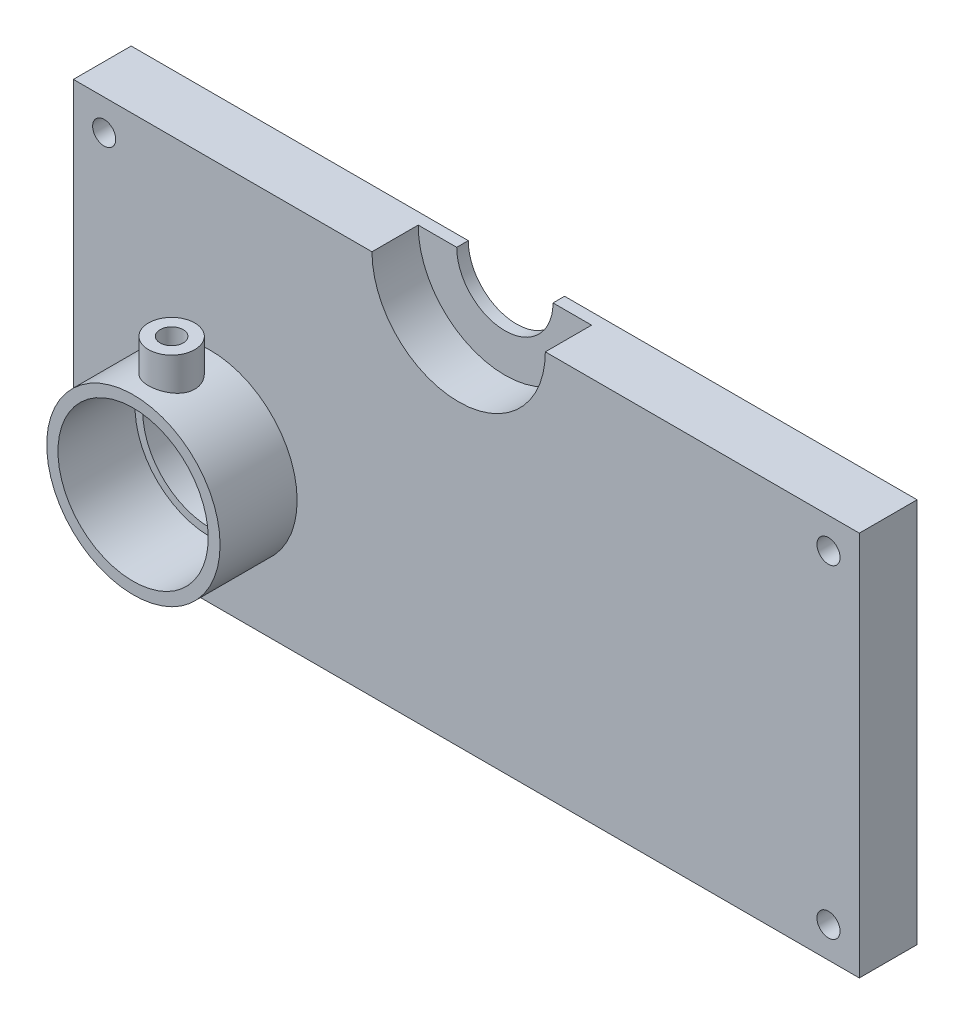
ISO-10303-21;
HEADER;
FILE_DESCRIPTION(('STEP AP214'),'2;1');
FILE_NAME('part.step','',(''),(''),'','','');
FILE_SCHEMA(('AUTOMOTIVE_DESIGN { 1 0 10303 214 1 1 1 1 }'));
ENDSEC;
DATA;
#1=APPLICATION_CONTEXT('core data for automotive mechanical design processes');
#2=APPLICATION_PROTOCOL_DEFINITION('international standard','automotive_design',2000,#1);
#3=PRODUCT_CONTEXT('',#1,'mechanical');
#4=PRODUCT('Part','Part','',(#3));
#5=PRODUCT_RELATED_PRODUCT_CATEGORY('part','',(#4));
#6=PRODUCT_DEFINITION_FORMATION('','',#4);
#7=PRODUCT_DEFINITION_CONTEXT('part definition',#1,'design');
#8=PRODUCT_DEFINITION('design','',#6,#7);
#9=PRODUCT_DEFINITION_SHAPE('','',#8);
#10=(LENGTH_UNIT() NAMED_UNIT(*) SI_UNIT(.MILLI.,.METRE.));
#11=(NAMED_UNIT(*) PLANE_ANGLE_UNIT() SI_UNIT($,.RADIAN.));
#12=(NAMED_UNIT(*) SI_UNIT($,.STERADIAN.) SOLID_ANGLE_UNIT());
#13=UNCERTAINTY_MEASURE_WITH_UNIT(LENGTH_MEASURE(1.E-05),#10,'distance_accuracy_value','');
#14=(GEOMETRIC_REPRESENTATION_CONTEXT(3) GLOBAL_UNCERTAINTY_ASSIGNED_CONTEXT((#13)) GLOBAL_UNIT_ASSIGNED_CONTEXT((#10,
#11,#12)) REPRESENTATION_CONTEXT('',''));
#15=CARTESIAN_POINT('',(0.,0.,0.));
#16=DIRECTION('',(0.,0.,1.));
#17=DIRECTION('',(1.,0.,0.));
#18=AXIS2_PLACEMENT_3D('',#15,#16,#17);
#19=CARTESIAN_POINT('',(-46.,-4.,115.5));
#20=DIRECTION('',(0.,0.,-1.));
#21=DIRECTION('',(-1.,0.,0.));
#22=AXIS2_PLACEMENT_3D('',#19,#20,#21);
#23=CYLINDRICAL_SURFACE('',#22,1.5);
#24=CARTESIAN_POINT('',(-46.,-4.,113.));
#25=DIRECTION('',(0.,0.,1.));
#26=DIRECTION('',(1.,0.,0.));
#27=AXIS2_PLACEMENT_3D('',#24,#25,#26);
#28=CIRCLE('',#27,1.5);
#29=CARTESIAN_POINT('',(-44.5,-4.,113.));
#30=VERTEX_POINT('',#29);
#31=EDGE_CURVE('E183',#30,#30,#28,.T.);
#32=ORIENTED_EDGE('',*,*,#31,.T.);
#33=EDGE_LOOP('',(#32));
#34=FACE_BOUND('',#33,.T.);
#35=CARTESIAN_POINT('',(-46.,-4.,107.5));
#36=DIRECTION('',(0.,0.,-1.));
#37=DIRECTION('',(-1.,0.,0.));
#38=AXIS2_PLACEMENT_3D('',#35,#36,#37);
#39=CIRCLE('',#38,1.5);
#40=CARTESIAN_POINT('',(-47.5,-4.,107.5));
#41=VERTEX_POINT('',#40);
#42=EDGE_CURVE('E190',#41,#41,#39,.F.);
#43=ORIENTED_EDGE('',*,*,#42,.F.);
#44=EDGE_LOOP('',(#43));
#45=FACE_BOUND('',#44,.T.);
#46=ADVANCED_FACE('F39',(#34,#45),#23,.F.);
#47=CARTESIAN_POINT('',(-46.,-46.,115.5));
#48=DIRECTION('',(0.,0.,-1.));
#49=DIRECTION('',(-1.,0.,0.));
#50=AXIS2_PLACEMENT_3D('',#47,#48,#49);
#51=CYLINDRICAL_SURFACE('',#50,1.5);
#52=CARTESIAN_POINT('',(-46.,-46.,113.));
#53=DIRECTION('',(0.,0.,1.));
#54=DIRECTION('',(1.,0.,0.));
#55=AXIS2_PLACEMENT_3D('',#52,#53,#54);
#56=CIRCLE('',#55,1.5);
#57=CARTESIAN_POINT('',(-44.5,-46.,113.));
#58=VERTEX_POINT('',#57);
#59=EDGE_CURVE('E339',#58,#58,#56,.T.);
#60=ORIENTED_EDGE('',*,*,#59,.T.);
#61=EDGE_LOOP('',(#60));
#62=FACE_BOUND('',#61,.T.);
#63=CARTESIAN_POINT('',(-46.,-46.,107.5));
#64=DIRECTION('',(0.,0.,-1.));
#65=DIRECTION('',(-1.,0.,0.));
#66=AXIS2_PLACEMENT_3D('',#63,#64,#65);
#67=CIRCLE('',#66,1.5);
#68=CARTESIAN_POINT('',(-47.5,-46.,107.5));
#69=VERTEX_POINT('',#68);
#70=EDGE_CURVE('E185',#69,#69,#67,.F.);
#71=ORIENTED_EDGE('',*,*,#70,.F.);
#72=EDGE_LOOP('',(#71));
#73=FACE_BOUND('',#72,.T.);
#74=ADVANCED_FACE('F275',(#62,#73),#51,.F.);
#75=CARTESIAN_POINT('',(48.,-46.,115.5));
#76=DIRECTION('',(0.,0.,-1.));
#77=DIRECTION('',(-1.,0.,0.));
#78=AXIS2_PLACEMENT_3D('',#75,#76,#77);
#79=CYLINDRICAL_SURFACE('',#78,1.5);
#80=CARTESIAN_POINT('',(48.,-46.,113.));
#81=DIRECTION('',(0.,0.,1.));
#82=DIRECTION('',(1.,0.,0.));
#83=AXIS2_PLACEMENT_3D('',#80,#81,#82);
#84=CIRCLE('',#83,1.5);
#85=CARTESIAN_POINT('',(49.5,-46.,113.));
#86=VERTEX_POINT('',#85);
#87=EDGE_CURVE('E345',#86,#86,#84,.T.);
#88=ORIENTED_EDGE('',*,*,#87,.T.);
#89=EDGE_LOOP('',(#88));
#90=FACE_BOUND('',#89,.T.);
#91=CARTESIAN_POINT('',(48.,-46.,107.5));
#92=DIRECTION('',(0.,0.,-1.));
#93=DIRECTION('',(-1.,0.,0.));
#94=AXIS2_PLACEMENT_3D('',#91,#92,#93);
#95=CIRCLE('',#94,1.5);
#96=CARTESIAN_POINT('',(46.5,-46.,107.5));
#97=VERTEX_POINT('',#96);
#98=EDGE_CURVE('E180',#97,#97,#95,.F.);
#99=ORIENTED_EDGE('',*,*,#98,.F.);
#100=EDGE_LOOP('',(#99));
#101=FACE_BOUND('',#100,.T.);
#102=ADVANCED_FACE('F277',(#90,#101),#79,.F.);
#103=CARTESIAN_POINT('',(48.,-4.,117.242640687119));
#104=DIRECTION('',(0.,0.,-1.));
#105=DIRECTION('',(-1.,0.,0.));
#106=AXIS2_PLACEMENT_3D('',#103,#104,#105);
#107=CYLINDRICAL_SURFACE('',#106,1.5);
#108=CARTESIAN_POINT('',(48.,-4.,113.));
#109=DIRECTION('',(0.,0.,1.));
#110=DIRECTION('',(1.,0.,0.));
#111=AXIS2_PLACEMENT_3D('',#108,#109,#110);
#112=CIRCLE('',#111,1.5);
#113=CARTESIAN_POINT('',(49.5,-4.,113.));
#114=VERTEX_POINT('',#113);
#115=EDGE_CURVE('E122',#114,#114,#112,.F.);
#116=ORIENTED_EDGE('',*,*,#115,.F.);
#117=EDGE_LOOP('',(#116));
#118=FACE_BOUND('',#117,.T.);
#119=CARTESIAN_POINT('',(48.,-4.,107.5));
#120=DIRECTION('',(0.,0.,-1.));
#121=DIRECTION('',(-1.,0.,0.));
#122=AXIS2_PLACEMENT_3D('',#119,#120,#121);
#123=CIRCLE('',#122,1.5);
#124=CARTESIAN_POINT('',(46.5,-4.,107.5));
#125=VERTEX_POINT('',#124);
#126=EDGE_CURVE('E176',#125,#125,#123,.F.);
#127=ORIENTED_EDGE('',*,*,#126,.F.);
#128=EDGE_LOOP('',(#127));
#129=FACE_BOUND('',#128,.T.);
#130=ADVANCED_FACE('F280',(#118,#129),#107,.F.);
#131=CARTESIAN_POINT('',(0.,0.,113.));
#132=DIRECTION('',(0.,0.,1.));
#133=DIRECTION('',(1.,0.,0.));
#134=AXIS2_PLACEMENT_3D('',#131,#132,#133);
#135=PLANE('',#134);
#136=CARTESIAN_POINT('',(-32.2094065569838,-32.8076807104213,113.));
#137=DIRECTION('',(0.,0.,1.));
#138=DIRECTION('',(1.,0.,0.));
#139=AXIS2_PLACEMENT_3D('',#136,#137,#138);
#140=CIRCLE('',#139,11.25);
#141=CARTESIAN_POINT('',(-20.9594065569838,-32.8076807104213,113.));
#142=VERTEX_POINT('',#141);
#143=EDGE_CURVE('E11',#142,#142,#140,.T.);
#144=ORIENTED_EDGE('',*,*,#143,.F.);
#145=EDGE_LOOP('',(#144));
#146=FACE_BOUND('',#145,.T.);
#147=DIRECTION('',(1.,0.,0.));
#148=VECTOR('',#147,1.);
#149=CARTESIAN_POINT('',(-50.,-50.,113.));
#150=LINE('',#149,#148);
#151=CARTESIAN_POINT('',(-50.,-50.,113.));
#152=VERTEX_POINT('',#151);
#153=CARTESIAN_POINT('',(52.,-50.,113.));
#154=VERTEX_POINT('',#153);
#155=EDGE_CURVE('E158',#152,#154,#150,.T.);
#156=ORIENTED_EDGE('',*,*,#155,.T.);
#157=DIRECTION('',(0.,-1.,0.));
#158=VECTOR('',#157,1.);
#159=CARTESIAN_POINT('',(52.,0.,113.));
#160=LINE('',#159,#158);
#161=CARTESIAN_POINT('',(52.,0.,113.));
#162=VERTEX_POINT('',#161);
#163=EDGE_CURVE('E127',#162,#154,#160,.T.);
#164=ORIENTED_EDGE('',*,*,#163,.F.);
#165=DIRECTION('',(-1.,0.,0.));
#166=VECTOR('',#165,1.);
#167=CARTESIAN_POINT('',(70.,0.,113.));
#168=LINE('',#167,#166);
#169=CARTESIAN_POINT('',(11.25,0.,113.));
#170=VERTEX_POINT('',#169);
#171=EDGE_CURVE('E126',#162,#170,#168,.T.);
#172=ORIENTED_EDGE('',*,*,#171,.T.);
#173=CARTESIAN_POINT('',(0.,0.,113.));
#174=DIRECTION('',(0.,0.,-1.));
#175=DIRECTION('',(1.,0.,0.));
#176=AXIS2_PLACEMENT_3D('',#173,#174,#175);
#177=CIRCLE('',#176,11.25);
#178=CARTESIAN_POINT('',(-11.25,0.,113.));
#179=VERTEX_POINT('',#178);
#180=EDGE_CURVE('E166',#170,#179,#177,.T.);
#181=ORIENTED_EDGE('',*,*,#180,.T.);
#182=DIRECTION('',(-1.,0.,0.));
#183=VECTOR('',#182,1.);
#184=CARTESIAN_POINT('',(-11.25,0.,113.));
#185=LINE('',#184,#183);
#186=CARTESIAN_POINT('',(-50.,0.,113.));
#187=VERTEX_POINT('',#186);
#188=EDGE_CURVE('E163',#179,#187,#185,.T.);
#189=ORIENTED_EDGE('',*,*,#188,.T.);
#190=DIRECTION('',(0.,-1.,0.));
#191=VECTOR('',#190,1.);
#192=CARTESIAN_POINT('',(-50.,0.,113.));
#193=LINE('',#192,#191);
#194=EDGE_CURVE('E160',#187,#152,#193,.T.);
#195=ORIENTED_EDGE('',*,*,#194,.T.);
#196=EDGE_LOOP('',(#156,#164,#172,#181,#189,#195));
#197=FACE_BOUND('',#196,.T.);
#198=ORIENTED_EDGE('',*,*,#31,.F.);
#199=EDGE_LOOP('',(#198));
#200=FACE_BOUND('',#199,.T.);
#201=ORIENTED_EDGE('',*,*,#59,.F.);
#202=EDGE_LOOP('',(#201));
#203=FACE_BOUND('',#202,.T.);
#204=ORIENTED_EDGE('',*,*,#115,.T.);
#205=EDGE_LOOP('',(#204));
#206=FACE_BOUND('',#205,.T.);
#207=ORIENTED_EDGE('',*,*,#87,.F.);
#208=EDGE_LOOP('',(#207));
#209=FACE_BOUND('',#208,.T.);
#210=ADVANCED_FACE('F294',(#146,#197,#200,#203,#206,#209),#135,.T.);
#211=CARTESIAN_POINT('',(0.,-50.,110.));
#212=DIRECTION('',(0.,1.,0.));
#213=DIRECTION('',(0.,0.,1.));
#214=AXIS2_PLACEMENT_3D('',#211,#212,#213);
#215=PLANE('',#214);
#216=DIRECTION('',(-1.,0.,0.));
#217=VECTOR('',#216,1.);
#218=CARTESIAN_POINT('',(70.,-50.,105.5));
#219=LINE('',#218,#217);
#220=CARTESIAN_POINT('',(52.,-50.,105.5));
#221=VERTEX_POINT('',#220);
#222=CARTESIAN_POINT('',(-50.,-50.,105.5));
#223=VERTEX_POINT('',#222);
#224=EDGE_CURVE('E134',#221,#223,#219,.T.);
#225=ORIENTED_EDGE('',*,*,#224,.F.);
#226=DIRECTION('',(0.,0.,-1.));
#227=VECTOR('',#226,1.);
#228=CARTESIAN_POINT('',(52.,-50.,145.));
#229=LINE('',#228,#227);
#230=EDGE_CURVE('E54',#154,#221,#229,.T.);
#231=ORIENTED_EDGE('',*,*,#230,.F.);
#232=ORIENTED_EDGE('',*,*,#155,.F.);
#233=DIRECTION('',(0.,0.,-1.));
#234=VECTOR('',#233,1.);
#235=CARTESIAN_POINT('',(-50.,-50.,110.));
#236=LINE('',#235,#234);
#237=EDGE_CURVE('E172',#152,#223,#236,.T.);
#238=ORIENTED_EDGE('',*,*,#237,.T.);
#239=EDGE_LOOP('',(#225,#231,#232,#238));
#240=FACE_BOUND('',#239,.T.);
#241=ADVANCED_FACE('F310',(#240),#215,.F.);
#242=CARTESIAN_POINT('',(0.,0.,110.));
#243=DIRECTION('',(0.,0.,-1.));
#244=DIRECTION('',(-1.,0.,0.));
#245=AXIS2_PLACEMENT_3D('',#242,#243,#244);
#246=CYLINDRICAL_SURFACE('',#245,11.25);
#247=CARTESIAN_POINT('',(0.,0.,107.));
#248=DIRECTION('',(0.,0.,1.));
#249=DIRECTION('',(1.,0.,0.));
#250=AXIS2_PLACEMENT_3D('',#247,#248,#249);
#251=CIRCLE('',#250,11.25);
#252=CARTESIAN_POINT('',(-11.25,0.,107.));
#253=VERTEX_POINT('',#252);
#254=CARTESIAN_POINT('',(11.25,0.,107.));
#255=VERTEX_POINT('',#254);
#256=EDGE_CURVE('E153',#253,#255,#251,.T.);
#257=ORIENTED_EDGE('',*,*,#256,.F.);
#258=DIRECTION('',(0.,0.,-1.));
#259=VECTOR('',#258,1.);
#260=CARTESIAN_POINT('',(-11.25,0.,110.));
#261=LINE('',#260,#259);
#262=EDGE_CURVE('E62',#179,#253,#261,.T.);
#263=ORIENTED_EDGE('',*,*,#262,.F.);
#264=ORIENTED_EDGE('',*,*,#180,.F.);
#265=DIRECTION('',(0.,0.,-1.));
#266=VECTOR('',#265,1.);
#267=CARTESIAN_POINT('',(11.25,0.,110.));
#268=LINE('',#267,#266);
#269=EDGE_CURVE('E156',#170,#255,#268,.T.);
#270=ORIENTED_EDGE('',*,*,#269,.T.);
#271=EDGE_LOOP('',(#257,#263,#264,#270));
#272=FACE_BOUND('',#271,.T.);
#273=ADVANCED_FACE('F312',(#272),#246,.F.);
#274=CARTESIAN_POINT('',(-50.,0.,110.));
#275=DIRECTION('',(1.,0.,0.));
#276=DIRECTION('',(0.,1.,0.));
#277=AXIS2_PLACEMENT_3D('',#274,#275,#276);
#278=PLANE('',#277);
#279=DIRECTION('',(0.,0.,-1.));
#280=VECTOR('',#279,1.);
#281=CARTESIAN_POINT('',(-50.,0.,110.));
#282=LINE('',#281,#280);
#283=CARTESIAN_POINT('',(-50.,0.,105.5));
#284=VERTEX_POINT('',#283);
#285=EDGE_CURVE('E170',#187,#284,#282,.T.);
#286=ORIENTED_EDGE('',*,*,#285,.T.);
#287=DIRECTION('',(0.,1.,0.));
#288=VECTOR('',#287,1.);
#289=CARTESIAN_POINT('',(-50.,-50.,105.5));
#290=LINE('',#289,#288);
#291=EDGE_CURVE('E136',#223,#284,#290,.T.);
#292=ORIENTED_EDGE('',*,*,#291,.F.);
#293=ORIENTED_EDGE('',*,*,#237,.F.);
#294=ORIENTED_EDGE('',*,*,#194,.F.);
#295=EDGE_LOOP('',(#286,#292,#293,#294));
#296=FACE_BOUND('',#295,.T.);
#297=ADVANCED_FACE('F315',(#296),#278,.F.);
#298=CARTESIAN_POINT('',(0.,0.,110.));
#299=DIRECTION('',(0.,1.,0.));
#300=DIRECTION('',(0.,0.,1.));
#301=AXIS2_PLACEMENT_3D('',#298,#299,#300);
#302=PLANE('',#301);
#303=ORIENTED_EDGE('',*,*,#262,.T.);
#304=DIRECTION('',(1.,0.,0.));
#305=VECTOR('',#304,1.);
#306=CARTESIAN_POINT('',(-6.25,0.,107.));
#307=LINE('',#306,#305);
#308=CARTESIAN_POINT('',(-6.25,0.,107.));
#309=VERTEX_POINT('',#308);
#310=EDGE_CURVE('E129',#253,#309,#307,.T.);
#311=ORIENTED_EDGE('',*,*,#310,.T.);
#312=DIRECTION('',(0.,0.,1.));
#313=VECTOR('',#312,1.);
#314=CARTESIAN_POINT('',(-6.25,0.,105.5));
#315=LINE('',#314,#313);
#316=CARTESIAN_POINT('',(-6.25,0.,105.5));
#317=VERTEX_POINT('',#316);
#318=EDGE_CURVE('E150',#317,#309,#315,.T.);
#319=ORIENTED_EDGE('',*,*,#318,.F.);
#320=DIRECTION('',(1.,0.,0.));
#321=VECTOR('',#320,1.);
#322=CARTESIAN_POINT('',(-50.,0.,105.5));
#323=LINE('',#322,#321);
#324=EDGE_CURVE('E140',#284,#317,#323,.T.);
#325=ORIENTED_EDGE('',*,*,#324,.F.);
#326=ORIENTED_EDGE('',*,*,#285,.F.);
#327=ORIENTED_EDGE('',*,*,#188,.F.);
#328=EDGE_LOOP('',(#303,#311,#319,#325,#326,#327));
#329=FACE_BOUND('',#328,.T.);
#330=ADVANCED_FACE('F317',(#329),#302,.T.);
#331=DIRECTION('',(0.,0.,-1.));
#332=VECTOR('',#331,1.);
#333=CARTESIAN_POINT('',(52.,0.,145.));
#334=LINE('',#333,#332);
#335=CARTESIAN_POINT('',(52.,0.,105.5));
#336=VERTEX_POINT('',#335);
#337=EDGE_CURVE('E120',#162,#336,#334,.T.);
#338=ORIENTED_EDGE('',*,*,#337,.T.);
#339=DIRECTION('',(1.,0.,0.));
#340=VECTOR('',#339,1.);
#341=CARTESIAN_POINT('',(11.25,0.,105.5));
#342=LINE('',#341,#340);
#343=CARTESIAN_POINT('',(6.25,0.,105.5));
#344=VERTEX_POINT('',#343);
#345=EDGE_CURVE('E106',#344,#336,#342,.T.);
#346=ORIENTED_EDGE('',*,*,#345,.F.);
#347=DIRECTION('',(0.,0.,1.));
#348=VECTOR('',#347,1.);
#349=CARTESIAN_POINT('',(6.25,0.,105.5));
#350=LINE('',#349,#348);
#351=CARTESIAN_POINT('',(6.25,0.,107.));
#352=VERTEX_POINT('',#351);
#353=EDGE_CURVE('E117',#344,#352,#350,.T.);
#354=ORIENTED_EDGE('',*,*,#353,.T.);
#355=DIRECTION('',(1.,0.,0.));
#356=VECTOR('',#355,1.);
#357=CARTESIAN_POINT('',(11.25,0.,107.));
#358=LINE('',#357,#356);
#359=EDGE_CURVE('E137',#352,#255,#358,.T.);
#360=ORIENTED_EDGE('',*,*,#359,.T.);
#361=ORIENTED_EDGE('',*,*,#269,.F.);
#362=ORIENTED_EDGE('',*,*,#171,.F.);
#363=EDGE_LOOP('',(#338,#346,#354,#360,#361,#362));
#364=FACE_BOUND('',#363,.T.);
#365=ADVANCED_FACE('F41',(#364),#302,.T.);
#366=CARTESIAN_POINT('',(0.,0.,105.5));
#367=DIRECTION('',(0.,0.,-1.));
#368=DIRECTION('',(-1.,0.,0.));
#369=AXIS2_PLACEMENT_3D('',#366,#367,#368);
#370=PLANE('',#369);
#371=ORIENTED_EDGE('',*,*,#345,.T.);
#372=DIRECTION('',(0.,1.,0.));
#373=VECTOR('',#372,1.);
#374=CARTESIAN_POINT('',(52.,-50.,105.5));
#375=LINE('',#374,#373);
#376=EDGE_CURVE('E109',#221,#336,#375,.T.);
#377=ORIENTED_EDGE('',*,*,#376,.F.);
#378=ORIENTED_EDGE('',*,*,#224,.T.);
#379=ORIENTED_EDGE('',*,*,#291,.T.);
#380=ORIENTED_EDGE('',*,*,#324,.T.);
#381=CARTESIAN_POINT('',(0.,0.,105.5));
#382=DIRECTION('',(0.,0.,1.));
#383=DIRECTION('',(-1.,0.,0.));
#384=AXIS2_PLACEMENT_3D('',#381,#382,#383);
#385=CIRCLE('',#384,6.25);
#386=EDGE_CURVE('E112',#317,#344,#385,.T.);
#387=ORIENTED_EDGE('',*,*,#386,.T.);
#388=EDGE_LOOP('',(#371,#377,#378,#379,#380,#387));
#389=FACE_BOUND('',#388,.T.);
#390=CARTESIAN_POINT('',(-32.25,-32.79,105.5));
#391=DIRECTION('',(0.,0.,-1.));
#392=DIRECTION('',(-1.,0.,0.));
#393=AXIS2_PLACEMENT_3D('',#390,#391,#392);
#394=CIRCLE('',#393,10.75);
#395=CARTESIAN_POINT('',(-43.,-32.79,105.5));
#396=VERTEX_POINT('',#395);
#397=EDGE_CURVE('E195',#396,#396,#394,.F.);
#398=ORIENTED_EDGE('',*,*,#397,.T.);
#399=EDGE_LOOP('',(#398));
#400=FACE_BOUND('',#399,.T.);
#401=CARTESIAN_POINT('',(-46.,-4.,105.5));
#402=DIRECTION('',(0.,0.,-1.));
#403=DIRECTION('',(-1.,0.,0.));
#404=AXIS2_PLACEMENT_3D('',#401,#402,#403);
#405=CIRCLE('',#404,2.5);
#406=CARTESIAN_POINT('',(-48.5,-4.,105.5));
#407=VERTEX_POINT('',#406);
#408=EDGE_CURVE('E194',#407,#407,#405,.T.);
#409=ORIENTED_EDGE('',*,*,#408,.F.);
#410=EDGE_LOOP('',(#409));
#411=FACE_BOUND('',#410,.T.);
#412=CARTESIAN_POINT('',(-46.,-46.,105.5));
#413=DIRECTION('',(0.,0.,-1.));
#414=DIRECTION('',(-1.,0.,0.));
#415=AXIS2_PLACEMENT_3D('',#412,#413,#414);
#416=CIRCLE('',#415,2.5);
#417=CARTESIAN_POINT('',(-48.5,-46.,105.5));
#418=VERTEX_POINT('',#417);
#419=EDGE_CURVE('E189',#418,#418,#416,.T.);
#420=ORIENTED_EDGE('',*,*,#419,.F.);
#421=EDGE_LOOP('',(#420));
#422=FACE_BOUND('',#421,.T.);
#423=CARTESIAN_POINT('',(48.,-4.,105.5));
#424=DIRECTION('',(0.,0.,-1.));
#425=DIRECTION('',(-1.,0.,0.));
#426=AXIS2_PLACEMENT_3D('',#423,#424,#425);
#427=CIRCLE('',#426,2.5);
#428=CARTESIAN_POINT('',(45.5,-4.,105.5));
#429=VERTEX_POINT('',#428);
#430=EDGE_CURVE('E347',#429,#429,#427,.T.);
#431=ORIENTED_EDGE('',*,*,#430,.F.);
#432=EDGE_LOOP('',(#431));
#433=FACE_BOUND('',#432,.T.);
#434=CARTESIAN_POINT('',(48.,-46.,105.5));
#435=DIRECTION('',(0.,0.,-1.));
#436=DIRECTION('',(-1.,0.,0.));
#437=AXIS2_PLACEMENT_3D('',#434,#435,#436);
#438=CIRCLE('',#437,2.5);
#439=CARTESIAN_POINT('',(45.5,-46.,105.5));
#440=VERTEX_POINT('',#439);
#441=EDGE_CURVE('E188',#440,#440,#438,.T.);
#442=ORIENTED_EDGE('',*,*,#441,.F.);
#443=EDGE_LOOP('',(#442));
#444=FACE_BOUND('',#443,.T.);
#445=ADVANCED_FACE('F107',(#389,#400,#411,#422,#433,#444),#370,.T.);
#446=CARTESIAN_POINT('',(0.,0.,107.));
#447=DIRECTION('',(0.,0.,-1.));
#448=DIRECTION('',(-1.,0.,0.));
#449=AXIS2_PLACEMENT_3D('',#446,#447,#448);
#450=PLANE('',#449);
#451=ORIENTED_EDGE('',*,*,#256,.T.);
#452=ORIENTED_EDGE('',*,*,#359,.F.);
#453=CARTESIAN_POINT('',(0.,0.,107.));
#454=DIRECTION('',(0.,0.,1.));
#455=DIRECTION('',(-1.,0.,0.));
#456=AXIS2_PLACEMENT_3D('',#453,#454,#455);
#457=CIRCLE('',#456,6.25);
#458=EDGE_CURVE('E144',#309,#352,#457,.T.);
#459=ORIENTED_EDGE('',*,*,#458,.F.);
#460=ORIENTED_EDGE('',*,*,#310,.F.);
#461=EDGE_LOOP('',(#451,#452,#459,#460));
#462=FACE_BOUND('',#461,.T.);
#463=ADVANCED_FACE('F301',(#462),#450,.F.);
#464=CARTESIAN_POINT('',(0.,0.,105.5));
#465=DIRECTION('',(0.,0.,1.));
#466=DIRECTION('',(1.,0.,0.));
#467=AXIS2_PLACEMENT_3D('',#464,#465,#466);
#468=CYLINDRICAL_SURFACE('',#467,6.25);
#469=ORIENTED_EDGE('',*,*,#458,.T.);
#470=ORIENTED_EDGE('',*,*,#353,.F.);
#471=ORIENTED_EDGE('',*,*,#386,.F.);
#472=ORIENTED_EDGE('',*,*,#318,.T.);
#473=EDGE_LOOP('',(#469,#470,#471,#472));
#474=FACE_BOUND('',#473,.T.);
#475=ADVANCED_FACE('F298',(#474),#468,.F.);
#476=CARTESIAN_POINT('',(52.,-50.,145.));
#477=DIRECTION('',(-1.,0.,0.));
#478=DIRECTION('',(0.,0.,1.));
#479=AXIS2_PLACEMENT_3D('',#476,#477,#478);
#480=PLANE('',#479);
#481=ORIENTED_EDGE('',*,*,#163,.T.);
#482=ORIENTED_EDGE('',*,*,#230,.T.);
#483=ORIENTED_EDGE('',*,*,#376,.T.);
#484=ORIENTED_EDGE('',*,*,#337,.F.);
#485=EDGE_LOOP('',(#481,#482,#483,#484));
#486=FACE_BOUND('',#485,.T.);
#487=ADVANCED_FACE('F119',(#486),#480,.F.);
#488=CARTESIAN_POINT('',(48.,-4.,107.5));
#489=DIRECTION('',(0.,0.,-1.));
#490=DIRECTION('',(-1.,0.,0.));
#491=AXIS2_PLACEMENT_3D('',#488,#489,#490);
#492=PLANE('',#491);
#493=CARTESIAN_POINT('',(48.,-4.,107.5));
#494=DIRECTION('',(0.,0.,-1.));
#495=DIRECTION('',(-1.,0.,0.));
#496=AXIS2_PLACEMENT_3D('',#493,#494,#495);
#497=CIRCLE('',#496,2.5);
#498=CARTESIAN_POINT('',(45.5,-4.,107.5));
#499=VERTEX_POINT('',#498);
#500=EDGE_CURVE('E179',#499,#499,#497,.T.);
#501=ORIENTED_EDGE('',*,*,#500,.T.);
#502=EDGE_LOOP('',(#501));
#503=FACE_BOUND('',#502,.T.);
#504=ORIENTED_EDGE('',*,*,#126,.T.);
#505=EDGE_LOOP('',(#504));
#506=FACE_BOUND('',#505,.T.);
#507=ADVANCED_FACE('F285',(#503,#506),#492,.T.);
#508=CARTESIAN_POINT('',(48.,-4.,107.5));
#509=DIRECTION('',(0.,0.,-1.));
#510=DIRECTION('',(-1.,0.,0.));
#511=AXIS2_PLACEMENT_3D('',#508,#509,#510);
#512=CYLINDRICAL_SURFACE('',#511,2.5);
#513=ORIENTED_EDGE('',*,*,#500,.F.);
#514=EDGE_LOOP('',(#513));
#515=FACE_BOUND('',#514,.T.);
#516=ORIENTED_EDGE('',*,*,#430,.T.);
#517=EDGE_LOOP('',(#516));
#518=FACE_BOUND('',#517,.T.);
#519=ADVANCED_FACE('F268',(#515,#518),#512,.F.);
#520=CARTESIAN_POINT('',(48.,-46.,107.5));
#521=DIRECTION('',(0.,0.,-1.));
#522=DIRECTION('',(-1.,0.,0.));
#523=AXIS2_PLACEMENT_3D('',#520,#521,#522);
#524=PLANE('',#523);
#525=CARTESIAN_POINT('',(48.,-46.,107.5));
#526=DIRECTION('',(0.,0.,-1.));
#527=DIRECTION('',(-1.,0.,0.));
#528=AXIS2_PLACEMENT_3D('',#525,#526,#527);
#529=CIRCLE('',#528,2.5);
#530=CARTESIAN_POINT('',(45.5,-46.,107.5));
#531=VERTEX_POINT('',#530);
#532=EDGE_CURVE('E184',#531,#531,#529,.T.);
#533=ORIENTED_EDGE('',*,*,#532,.T.);
#534=EDGE_LOOP('',(#533));
#535=FACE_BOUND('',#534,.T.);
#536=ORIENTED_EDGE('',*,*,#98,.T.);
#537=EDGE_LOOP('',(#536));
#538=FACE_BOUND('',#537,.T.);
#539=ADVANCED_FACE('F265',(#535,#538),#524,.T.);
#540=CARTESIAN_POINT('',(48.,-46.,107.5));
#541=DIRECTION('',(0.,0.,-1.));
#542=DIRECTION('',(-1.,0.,0.));
#543=AXIS2_PLACEMENT_3D('',#540,#541,#542);
#544=CYLINDRICAL_SURFACE('',#543,2.5);
#545=ORIENTED_EDGE('',*,*,#532,.F.);
#546=EDGE_LOOP('',(#545));
#547=FACE_BOUND('',#546,.T.);
#548=ORIENTED_EDGE('',*,*,#441,.T.);
#549=EDGE_LOOP('',(#548));
#550=FACE_BOUND('',#549,.T.);
#551=ADVANCED_FACE('F263',(#547,#550),#544,.F.);
#552=CARTESIAN_POINT('',(-46.,-46.,107.5));
#553=DIRECTION('',(0.,0.,-1.));
#554=DIRECTION('',(-1.,0.,0.));
#555=AXIS2_PLACEMENT_3D('',#552,#553,#554);
#556=PLANE('',#555);
#557=CARTESIAN_POINT('',(-46.,-46.,107.5));
#558=DIRECTION('',(0.,0.,-1.));
#559=DIRECTION('',(-1.,0.,0.));
#560=AXIS2_PLACEMENT_3D('',#557,#558,#559);
#561=CIRCLE('',#560,2.5);
#562=CARTESIAN_POINT('',(-48.5,-46.,107.5));
#563=VERTEX_POINT('',#562);
#564=EDGE_CURVE('E193',#563,#563,#561,.T.);
#565=ORIENTED_EDGE('',*,*,#564,.T.);
#566=EDGE_LOOP('',(#565));
#567=FACE_BOUND('',#566,.T.);
#568=ORIENTED_EDGE('',*,*,#70,.T.);
#569=EDGE_LOOP('',(#568));
#570=FACE_BOUND('',#569,.T.);
#571=ADVANCED_FACE('F259',(#567,#570),#556,.T.);
#572=CARTESIAN_POINT('',(-46.,-46.,107.5));
#573=DIRECTION('',(0.,0.,-1.));
#574=DIRECTION('',(-1.,0.,0.));
#575=AXIS2_PLACEMENT_3D('',#572,#573,#574);
#576=CYLINDRICAL_SURFACE('',#575,2.5);
#577=ORIENTED_EDGE('',*,*,#564,.F.);
#578=EDGE_LOOP('',(#577));
#579=FACE_BOUND('',#578,.T.);
#580=ORIENTED_EDGE('',*,*,#419,.T.);
#581=EDGE_LOOP('',(#580));
#582=FACE_BOUND('',#581,.T.);
#583=ADVANCED_FACE('F255',(#579,#582),#576,.F.);
#584=CARTESIAN_POINT('',(-46.,-4.,107.5));
#585=DIRECTION('',(0.,0.,-1.));
#586=DIRECTION('',(-1.,0.,0.));
#587=AXIS2_PLACEMENT_3D('',#584,#585,#586);
#588=PLANE('',#587);
#589=CARTESIAN_POINT('',(-46.,-4.,107.5));
#590=DIRECTION('',(0.,0.,-1.));
#591=DIRECTION('',(-1.,0.,0.));
#592=AXIS2_PLACEMENT_3D('',#589,#590,#591);
#593=CIRCLE('',#592,2.5);
#594=CARTESIAN_POINT('',(-48.5,-4.,107.5));
#595=VERTEX_POINT('',#594);
#596=EDGE_CURVE('E197',#595,#595,#593,.T.);
#597=ORIENTED_EDGE('',*,*,#596,.T.);
#598=EDGE_LOOP('',(#597));
#599=FACE_BOUND('',#598,.T.);
#600=ORIENTED_EDGE('',*,*,#42,.T.);
#601=EDGE_LOOP('',(#600));
#602=FACE_BOUND('',#601,.T.);
#603=ADVANCED_FACE('F251',(#599,#602),#588,.T.);
#604=CARTESIAN_POINT('',(-46.,-4.,107.5));
#605=DIRECTION('',(0.,0.,-1.));
#606=DIRECTION('',(-1.,0.,0.));
#607=AXIS2_PLACEMENT_3D('',#604,#605,#606);
#608=CYLINDRICAL_SURFACE('',#607,2.5);
#609=ORIENTED_EDGE('',*,*,#596,.F.);
#610=EDGE_LOOP('',(#609));
#611=FACE_BOUND('',#610,.T.);
#612=ORIENTED_EDGE('',*,*,#408,.T.);
#613=EDGE_LOOP('',(#612));
#614=FACE_BOUND('',#613,.T.);
#615=ADVANCED_FACE('F247',(#611,#614),#608,.F.);
#616=CARTESIAN_POINT('',(-32.25,-32.79,68.5944084089785));
#617=DIRECTION('',(0.,0.,1.));
#618=DIRECTION('',(1.,0.,0.));
#619=AXIS2_PLACEMENT_3D('',#616,#617,#618);
#620=CYLINDRICAL_SURFACE('',#619,10.75);
#621=ORIENTED_EDGE('',*,*,#397,.F.);
#622=EDGE_LOOP('',(#621));
#623=FACE_BOUND('',#622,.T.);
#624=CARTESIAN_POINT('',(-32.25,-32.79,99.));
#625=DIRECTION('',(0.,0.,-1.));
#626=DIRECTION('',(-1.,0.,0.));
#627=AXIS2_PLACEMENT_3D('',#624,#625,#626);
#628=CIRCLE('',#627,10.75);
#629=CARTESIAN_POINT('',(-43.,-32.79,99.));
#630=VERTEX_POINT('',#629);
#631=EDGE_CURVE('E198',#630,#630,#628,.T.);
#632=ORIENTED_EDGE('',*,*,#631,.F.);
#633=EDGE_LOOP('',(#632));
#634=FACE_BOUND('',#633,.T.);
#635=ADVANCED_FACE('F243',(#623,#634),#620,.T.);
#636=CARTESIAN_POINT('',(32.86,-32.68,99.));
#637=DIRECTION('',(0.,0.,-1.));
#638=DIRECTION('',(-1.,0.,0.));
#639=AXIS2_PLACEMENT_3D('',#636,#637,#638);
#640=PLANE('',#639);
#641=CARTESIAN_POINT('',(-32.25,-32.79,99.));
#642=DIRECTION('',(0.,0.,-1.));
#643=DIRECTION('',(-1.,0.,0.));
#644=AXIS2_PLACEMENT_3D('',#641,#642,#643);
#645=CIRCLE('',#644,8.75);
#646=CARTESIAN_POINT('',(-41.,-32.79,99.));
#647=VERTEX_POINT('',#646);
#648=EDGE_CURVE('E680',#647,#647,#645,.T.);
#649=ORIENTED_EDGE('',*,*,#648,.F.);
#650=EDGE_LOOP('',(#649));
#651=FACE_BOUND('',#650,.T.);
#652=ORIENTED_EDGE('',*,*,#631,.T.);
#653=EDGE_LOOP('',(#652));
#654=FACE_BOUND('',#653,.T.);
#655=ADVANCED_FACE('F239',(#651,#654),#640,.T.);
#656=CARTESIAN_POINT('',(32.86,-32.68,123.));
#657=DIRECTION('',(0.,0.,1.));
#658=DIRECTION('',(1.,0.,0.));
#659=AXIS2_PLACEMENT_3D('',#656,#657,#658);
#660=PLANE('',#659);
#661=CARTESIAN_POINT('',(-32.25,-32.79,123.));
#662=DIRECTION('',(0.,0.,1.));
#663=DIRECTION('',(1.,0.,0.));
#664=AXIS2_PLACEMENT_3D('',#661,#662,#663);
#665=CIRCLE('',#664,9.75);
#666=CARTESIAN_POINT('',(-22.5,-32.79,123.));
#667=VERTEX_POINT('',#666);
#668=EDGE_CURVE('E672',#667,#667,#665,.T.);
#669=ORIENTED_EDGE('',*,*,#668,.F.);
#670=EDGE_LOOP('',(#669));
#671=FACE_BOUND('',#670,.T.);
#672=CARTESIAN_POINT('',(-32.2094065569838,-32.8076807104213,123.));
#673=DIRECTION('',(0.,0.,1.));
#674=DIRECTION('',(1.,0.,0.));
#675=AXIS2_PLACEMENT_3D('',#672,#673,#674);
#676=CIRCLE('',#675,11.25);
#677=CARTESIAN_POINT('',(-20.9594065569838,-32.8076807104213,123.));
#678=VERTEX_POINT('',#677);
#679=EDGE_CURVE('E227',#678,#678,#676,.T.);
#680=ORIENTED_EDGE('',*,*,#679,.T.);
#681=EDGE_LOOP('',(#680));
#682=FACE_BOUND('',#681,.T.);
#683=ADVANCED_FACE('F236',(#671,#682),#660,.T.);
#684=CARTESIAN_POINT('',(-32.2094065569838,-32.8076807104213,81.1801948466054));
#685=DIRECTION('',(0.,0.,1.));
#686=DIRECTION('',(1.,0.,0.));
#687=AXIS2_PLACEMENT_3D('',#684,#685,#686);
#688=CYLINDRICAL_SURFACE('',#687,11.25);
#689=ORIENTED_EDGE('',*,*,#679,.F.);
#690=EDGE_LOOP('',(#689));
#691=FACE_BOUND('',#690,.T.);
#692=ORIENTED_EDGE('',*,*,#143,.T.);
#693=EDGE_LOOP('',(#692));
#694=FACE_BOUND('',#693,.T.);
#695=CARTESIAN_POINT('',(-32.25,-21.5577539474426,115.));
#696=CARTESIAN_POINT('',(-32.4154768633816,-21.5583535784474,115.000003980944));
#697=CARTESIAN_POINT('',(-32.5809831135079,-21.562635315604,115.013737289353));
#698=CARTESIAN_POINT('',(-32.907200531887,-21.5781527674895,115.068197730675));
#699=CARTESIAN_POINT('',(-33.0679093035032,-21.5893918988847,115.108938127038));
#700=CARTESIAN_POINT('',(-33.3797771734199,-21.6176301618664,115.215983245237));
#701=CARTESIAN_POINT('',(-33.5309485353168,-21.6346217099711,115.282254325443));
#702=CARTESIAN_POINT('',(-33.8200213604739,-21.672614361303,115.438354549169));
#703=CARTESIAN_POINT('',(-33.9579219463401,-21.693615729365,115.528185248866));
#704=CARTESIAN_POINT('',(-34.219794117849,-21.7379530204198,115.73109575534));
#705=CARTESIAN_POINT('',(-34.3434079368268,-21.7613290331632,115.844628554976));
#706=CARTESIAN_POINT('',(-34.570080432813,-21.8075384632834,116.090753331067));
#707=CARTESIAN_POINT('',(-34.6731364568754,-21.8303718102957,116.223347763597));
#708=CARTESIAN_POINT('',(-34.8574476177956,-21.8733534061958,116.506601536664));
#709=CARTESIAN_POINT('',(-34.9383052081923,-21.8934497995654,116.657528130639));
#710=CARTESIAN_POINT('',(-35.0733503464633,-21.9281025584128,116.971469327741));
#711=CARTESIAN_POINT('',(-35.1275430185222,-21.9426599881886,117.134481601433));
#712=CARTESIAN_POINT('',(-35.2064528498197,-21.9641636388092,117.463909129933));
#713=CARTESIAN_POINT('',(-35.2318338569451,-21.9712809670022,117.630153938362));
#714=CARTESIAN_POINT('',(-35.2544707229852,-21.9776191067286,117.964682538408));
#715=CARTESIAN_POINT('',(-35.2517319563705,-21.9768414272178,118.132965934254));
#716=CARTESIAN_POINT('',(-35.2187270291179,-21.9676274483977,118.461711873831));
#717=CARTESIAN_POINT('',(-35.1892482842081,-21.9594102351893,118.622260581307));
#718=CARTESIAN_POINT('',(-35.1048597015684,-21.9365840166103,118.936043833827));
#719=CARTESIAN_POINT('',(-35.0499478006892,-21.9219744926978,119.089277784382));
#720=CARTESIAN_POINT('',(-34.9156081869283,-21.8877994897766,119.386141652402));
#721=CARTESIAN_POINT('',(-34.8359036842668,-21.8681785282093,119.529639659802));
#722=CARTESIAN_POINT('',(-34.6544388207268,-21.8261977497566,119.801498537176));
#723=CARTESIAN_POINT('',(-34.552674032163,-21.803837383442,119.92985636039));
#724=CARTESIAN_POINT('',(-34.3259377482359,-21.7579481721029,120.172312389678));
#725=CARTESIAN_POINT('',(-34.2003024833645,-21.7344052880612,120.285788081026));
#726=CARTESIAN_POINT('',(-33.9315079372061,-21.6894340803747,120.490188580253));
#727=CARTESIAN_POINT('',(-33.7883478695966,-21.6680058516905,120.581112375694));
#728=CARTESIAN_POINT('',(-33.4875121085775,-21.6294864170923,120.738154681095));
#729=CARTESIAN_POINT('',(-33.3297669222011,-21.6124176038825,120.804145920442));
#730=CARTESIAN_POINT('',(-33.0048574880141,-21.5846551423132,120.908485109137));
#731=CARTESIAN_POINT('',(-32.8376953139492,-21.5739600963256,120.946839119113));
#732=CARTESIAN_POINT('',(-32.503895145717,-21.5603313783665,120.993846858852));
#733=CARTESIAN_POINT('',(-32.337382598554,-21.5571815706079,121.003329835222));
#734=CARTESIAN_POINT('',(-32.0051222795278,-21.5583092493875,120.994602749251));
#735=CARTESIAN_POINT('',(-31.8393744269798,-21.5625859334934,120.976395678845));
#736=CARTESIAN_POINT('',(-31.5164315416854,-21.577900105709,120.913496386527));
#737=CARTESIAN_POINT('',(-31.3591364003418,-21.5888148863772,120.869285333674));
#738=CARTESIAN_POINT('',(-31.0541992933475,-21.6161011947315,120.756177498346));
#739=CARTESIAN_POINT('',(-30.9065583393468,-21.6324732931902,120.687278133701));
#740=CARTESIAN_POINT('',(-30.6220309045898,-21.6692910632521,120.525276668506));
#741=CARTESIAN_POINT('',(-30.4853998997416,-21.6898077665677,120.431742438853));
#742=CARTESIAN_POINT('',(-30.229478820641,-21.7325171332581,120.223669132916));
#743=CARTESIAN_POINT('',(-30.1101921369895,-21.7547101230413,120.109125959514));
#744=CARTESIAN_POINT('',(-29.8888886932469,-21.7990108858182,119.858461177149));
#745=CARTESIAN_POINT('',(-29.787450901624,-21.821098768549,119.721823978457));
#746=CARTESIAN_POINT('',(-29.6089239968263,-21.8619779016708,119.43301529213));
#747=CARTESIAN_POINT('',(-29.5318339700235,-21.8807692757484,119.280844387667));
#748=CARTESIAN_POINT('',(-29.4047173741663,-21.9127039200495,118.965939962586));
#749=CARTESIAN_POINT('',(-29.3545517613135,-21.9258761349985,118.803265666532));
#750=CARTESIAN_POINT('',(-29.2824060621586,-21.9450572780414,118.471385832459));
#751=CARTESIAN_POINT('',(-29.2604189768093,-21.9510679849009,118.302181927038));
#752=CARTESIAN_POINT('',(-29.2456575019529,-21.9550892588466,117.967836137096));
#753=CARTESIAN_POINT('',(-29.2519737800098,-21.9533488650073,117.802736814535));
#754=CARTESIAN_POINT('',(-29.2915300850424,-21.9426492771837,117.476046301032));
#755=CARTESIAN_POINT('',(-29.3247694405956,-21.9336902632214,117.314455022706));
#756=CARTESIAN_POINT('',(-29.4166991652385,-21.9097222357156,117.000517506315));
#757=CARTESIAN_POINT('',(-29.4751956911687,-21.8947593610886,116.848110733515));
#758=CARTESIAN_POINT('',(-29.6158307694377,-21.8604856512545,116.555159543688));
#759=CARTESIAN_POINT('',(-29.6979729723079,-21.8411741447854,116.414616962646));
#760=CARTESIAN_POINT('',(-29.8863421296402,-21.7997103779783,116.14502497273));
#761=CARTESIAN_POINT('',(-29.9931930360042,-21.7774924607874,116.016421564473));
#762=CARTESIAN_POINT('',(-30.2267635766931,-21.7331272952101,115.778673132738));
#763=CARTESIAN_POINT('',(-30.3534879313242,-21.7109800648917,115.669532745278));
#764=CARTESIAN_POINT('',(-30.6263434981406,-21.6687475269431,115.47161710575));
#765=CARTESIAN_POINT('',(-30.7728187806726,-21.6487136886779,115.383304306647));
#766=CARTESIAN_POINT('',(-31.0790661656027,-21.6135521994348,115.232692841742));
#767=CARTESIAN_POINT('',(-31.2388295776273,-21.5984213731262,115.170377331806));
#768=CARTESIAN_POINT('',(-31.5400231003169,-21.5767696978462,115.08171575655));
#769=CARTESIAN_POINT('',(-31.6801508086031,-21.5692424835571,115.051141256548));
#770=CARTESIAN_POINT('',(-31.9635118674539,-21.5594753060095,115.010282618788));
#771=CARTESIAN_POINT('',(-32.1067449217073,-21.5572348405126,114.999996553655));
#772=CARTESIAN_POINT('',(-32.25,-21.5577539474426,115.));
#773=B_SPLINE_CURVE_WITH_KNOTS('',3,(#695,#696,#697,#698,#699,#700,#701,#702,#703,#704,#705,
#706,#707,#708,#709,#710,#711,#712,#713,#714,#715,#716,#717,#718,#719,#720,#721,#722,#723,#724,
#725,#726,#727,#728,#729,#730,#731,#732,#733,#734,#735,#736,#737,#738,#739,#740,#741,#742,#743,
#744,#745,#746,#747,#748,#749,#750,#751,#752,#753,#754,#755,#756,#757,#758,#759,#760,#761,#762,
#763,#764,#765,#766,#767,#768,#769,#770,#771,#772),.UNSPECIFIED.,.T.,.F.,(4,2,2,2,2,2,2,2,2,2,2,
2,2,2,2,2,2,2,2,2,2,2,2,2,2,2,2,2,2,2,2,2,2,2,2,2,2,2,4),(0.,0.495907899653028,
0.992059525245708,1.48755959872095,1.9830924095837,2.48914288769853,2.99525862851809,
3.50992127223932,4.02448497482082,4.5269353855854,5.02928976589134,5.51731506189958,
6.00537995367991,6.49910209984125,6.99292343209672,7.50330436615868,8.01370820896531,
8.52668334347717,9.03954595231354,9.53753192045913,10.0354640845785,10.5244603070572,
11.0135076889803,11.5117824204145,12.0101544278338,12.5225201616341,13.0348666670868,
13.5445411992005,14.0540891126352,14.5473857142175,15.0406700140793,15.5302339466032,
16.0198735008982,16.5235752978807,17.0273969149243,17.5415286469397,18.0553267439922,
18.4846802701663,18.9139930063337),.UNSPECIFIED.);
#774=CARTESIAN_POINT('',(-32.25,-21.5577539474426,115.));
#775=VERTEX_POINT('',#774);
#776=EDGE_CURVE('E220',#775,#775,#773,.T.);
#777=ORIENTED_EDGE('',*,*,#776,.F.);
#778=EDGE_LOOP('',(#777));
#779=FACE_BOUND('',#778,.T.);
#780=ADVANCED_FACE('F214',(#691,#694,#779),#688,.T.);
#781=CARTESIAN_POINT('',(-32.25,-9.01471862576142,118.));
#782=DIRECTION('',(0.,-1.,0.));
#783=DIRECTION('',(0.,0.,-1.));
#784=AXIS2_PLACEMENT_3D('',#781,#782,#783);
#785=CYLINDRICAL_SURFACE('',#784,3.);
#786=ORIENTED_EDGE('',*,*,#776,.T.);
#787=EDGE_LOOP('',(#786));
#788=FACE_BOUND('',#787,.T.);
#789=CARTESIAN_POINT('',(-32.25,-17.5,118.));
#790=DIRECTION('',(0.,1.,0.));
#791=DIRECTION('',(0.,0.,1.));
#792=AXIS2_PLACEMENT_3D('',#789,#790,#791);
#793=CIRCLE('',#792,3.);
#794=CARTESIAN_POINT('',(-32.25,-17.5,121.));
#795=VERTEX_POINT('',#794);
#796=EDGE_CURVE('E229',#795,#795,#793,.T.);
#797=ORIENTED_EDGE('',*,*,#796,.F.);
#798=EDGE_LOOP('',(#797));
#799=FACE_BOUND('',#798,.T.);
#800=ADVANCED_FACE('F231',(#788,#799),#785,.T.);
#801=CARTESIAN_POINT('',(32.86,-17.5,118.));
#802=DIRECTION('',(0.,1.,0.));
#803=DIRECTION('',(0.,0.,1.));
#804=AXIS2_PLACEMENT_3D('',#801,#802,#803);
#805=PLANE('',#804);
#806=CARTESIAN_POINT('',(-32.25,-17.5,118.));
#807=DIRECTION('',(0.,1.,0.));
#808=DIRECTION('',(0.,0.,1.));
#809=AXIS2_PLACEMENT_3D('',#806,#807,#808);
#810=CIRCLE('',#809,1.5);
#811=CARTESIAN_POINT('',(-32.25,-17.5,119.5));
#812=VERTEX_POINT('',#811);
#813=EDGE_CURVE('E226',#812,#812,#810,.T.);
#814=ORIENTED_EDGE('',*,*,#813,.F.);
#815=EDGE_LOOP('',(#814));
#816=FACE_BOUND('',#815,.T.);
#817=ORIENTED_EDGE('',*,*,#796,.T.);
#818=EDGE_LOOP('',(#817));
#819=FACE_BOUND('',#818,.T.);
#820=ADVANCED_FACE('F217',(#816,#819),#805,.T.);
#821=CARTESIAN_POINT('',(-32.25,-9.01471862576142,118.));
#822=DIRECTION('',(0.,-1.,0.));
#823=DIRECTION('',(0.,0.,-1.));
#824=AXIS2_PLACEMENT_3D('',#821,#822,#823);
#825=CYLINDRICAL_SURFACE('',#824,1.5);
#826=CARTESIAN_POINT('',(-32.25,-21.5577539474426,116.5));
#827=CARTESIAN_POINT('',(-32.3338819654405,-21.5580578566096,116.500003539255));
#828=CARTESIAN_POINT('',(-32.4178119129025,-21.5593075360738,116.507059939084));
#829=CARTESIAN_POINT('',(-32.5833260562954,-21.5635907514939,116.535092742704));
#830=CARTESIAN_POINT('',(-32.6649077515966,-21.5666261202883,116.556083451572));
#831=CARTESIAN_POINT('',(-32.8233058706321,-21.5741633901945,116.611349895417));
#832=CARTESIAN_POINT('',(-32.9001256447237,-21.5786642459632,116.645616164134));
#833=CARTESIAN_POINT('',(-33.0469084090141,-21.5886562635461,116.726439306963));
#834=CARTESIAN_POINT('',(-33.1168725050613,-21.5941472652386,116.772994194383));
#835=CARTESIAN_POINT('',(-33.2484210104832,-21.6055675160041,116.877393002065));
#836=CARTESIAN_POINT('',(-33.3099550141022,-21.611499099751,116.935300188916));
#837=CARTESIAN_POINT('',(-33.4224608704641,-21.6231285925666,117.060624134275));
#838=CARTESIAN_POINT('',(-33.473432169079,-21.6288264893634,117.128041391377));
#839=CARTESIAN_POINT('',(-33.5635405693637,-21.6393820867571,117.270781099592));
#840=CARTESIAN_POINT('',(-33.6026335385311,-21.6442366260439,117.346131663513));
#841=CARTESIAN_POINT('',(-33.6675897554375,-21.652534785698,117.502407133653));
#842=CARTESIAN_POINT('',(-33.6934536126748,-21.6559784710653,117.583331782864));
#843=CARTESIAN_POINT('',(-33.7310568038163,-21.661047054635,117.747908830108));
#844=CARTESIAN_POINT('',(-33.7428854684843,-21.6626834511468,117.831540457731));
#845=CARTESIAN_POINT('',(-33.752359433518,-21.663990985714,117.999616487657));
#846=CARTESIAN_POINT('',(-33.7500054103236,-21.6636622174976,118.084060851006));
#847=CARTESIAN_POINT('',(-33.7312520959814,-21.6610860582065,118.25075850447));
#848=CARTESIAN_POINT('',(-33.7149486037589,-21.658851753867,118.333022802659));
#849=CARTESIAN_POINT('',(-33.6689088854552,-21.6527316940895,118.49363672939));
#850=CARTESIAN_POINT('',(-33.6391723461574,-21.6488459001439,118.571986266603));
#851=CARTESIAN_POINT('',(-33.5670093006978,-21.6398369358269,118.722842282313));
#852=CARTESIAN_POINT('',(-33.5245415295222,-21.634709752367,118.795328772075));
#853=CARTESIAN_POINT('',(-33.4281519824543,-21.6237858296981,118.932182309336));
#854=CARTESIAN_POINT('',(-33.3742295828053,-21.6179890540346,118.996548914366));
#855=CARTESIAN_POINT('',(-33.2559279776313,-21.6063037044292,119.11589735598));
#856=CARTESIAN_POINT('',(-33.1914654644593,-21.6004147680117,119.170796612299));
#857=CARTESIAN_POINT('',(-33.0541998417261,-21.5892334853408,119.269009248581));
#858=CARTESIAN_POINT('',(-32.9813966878729,-21.5839411422559,119.312322567014));
#859=CARTESIAN_POINT('',(-32.8294251546818,-21.5745213009363,119.386148500132));
#860=CARTESIAN_POINT('',(-32.7502520743053,-21.5703946733271,119.416651555583));
#861=CARTESIAN_POINT('',(-32.5878389812426,-21.5637539673358,119.463904533562));
#862=CARTESIAN_POINT('',(-32.5045991865417,-21.5612398026237,119.480655192396));
#863=CARTESIAN_POINT('',(-32.3370980306664,-21.5580959810788,119.499821854794));
#864=CARTESIAN_POINT('',(-32.2528493918023,-21.5574520260167,119.502346758422));
#865=CARTESIAN_POINT('',(-32.0851245822683,-21.5580546167727,119.493274640711));
#866=CARTESIAN_POINT('',(-32.0016483910273,-21.5593011120993,119.481677996542));
#867=CARTESIAN_POINT('',(-31.8381957054938,-21.5635105431954,119.444786474571));
#868=CARTESIAN_POINT('',(-31.7582060575371,-21.5664662926566,119.419548976586));
#869=CARTESIAN_POINT('',(-31.6035916198323,-21.5737373229864,119.356148318294));
#870=CARTESIAN_POINT('',(-31.5289670224644,-21.578052652577,119.317984694761));
#871=CARTESIAN_POINT('',(-31.3867513708145,-21.5875714315248,119.229573351667));
#872=CARTESIAN_POINT('',(-31.3192010137764,-21.5927796088068,119.179260687473));
#873=CARTESIAN_POINT('',(-31.1934636303101,-21.6034694742367,119.068070659523));
#874=CARTESIAN_POINT('',(-31.1352770249744,-21.6089511746706,119.0071928209));
#875=CARTESIAN_POINT('',(-31.0295329075081,-21.6195956026971,118.876125431694));
#876=CARTESIAN_POINT('',(-30.9820471454841,-21.6247560184186,118.805877775477));
#877=CARTESIAN_POINT('',(-30.8995471843203,-21.6341181817369,118.658346164468));
#878=CARTESIAN_POINT('',(-30.8645327356656,-21.6383199485128,118.581062350488));
#879=CARTESIAN_POINT('',(-30.8080701321621,-21.6452630106795,118.421846172306));
#880=CARTESIAN_POINT('',(-30.7865876417873,-21.6480079996353,118.339926152828));
#881=CARTESIAN_POINT('',(-30.7576912271218,-21.6517299056329,118.173603393842));
#882=CARTESIAN_POINT('',(-30.7502765888074,-21.6527069124098,118.089200780561));
#883=CARTESIAN_POINT('',(-30.7497406401149,-21.6527770862947,117.920985883775));
#884=CARTESIAN_POINT('',(-30.7565124109274,-21.6518843451581,117.837173926928));
#885=CARTESIAN_POINT('',(-30.7839298199057,-21.6483481029154,117.671890424576));
#886=CARTESIAN_POINT('',(-30.8045754586568,-21.6457046017353,117.59041887917));
#887=CARTESIAN_POINT('',(-30.8591198787625,-21.6389755477597,117.432147817764));
#888=CARTESIAN_POINT('',(-30.8930127558054,-21.6348906374808,117.355346237952));
#889=CARTESIAN_POINT('',(-30.9730796436689,-21.6257483077036,117.208502394012));
#890=CARTESIAN_POINT('',(-31.0192538681162,-21.6206908712891,117.138460247489));
#891=CARTESIAN_POINT('',(-31.122968754481,-21.6101416117875,117.006577163909));
#892=CARTESIAN_POINT('',(-31.1805891436805,-21.6046469137481,116.944799149833));
#893=CARTESIAN_POINT('',(-31.3053946480614,-21.593886658191,116.831748868933));
#894=CARTESIAN_POINT('',(-31.3725819793175,-21.5886211541335,116.780479042945));
#895=CARTESIAN_POINT('',(-31.5149179362986,-21.5789100835004,116.689729739646));
#896=CARTESIAN_POINT('',(-31.5900966175363,-21.5744677980555,116.650297071035));
#897=CARTESIAN_POINT('',(-31.7460277059503,-21.5669579407956,116.584672470896));
#898=CARTESIAN_POINT('',(-31.8267740299065,-21.5638888952053,116.558466340625));
#899=CARTESIAN_POINT('',(-31.9649364449169,-21.56019796525,116.526218722634));
#900=CARTESIAN_POINT('',(-32.0214878832506,-21.5591062258074,116.516400817147));
#901=CARTESIAN_POINT('',(-32.1353520796893,-21.557780356321,116.503290274541));
#902=CARTESIAN_POINT('',(-32.1926648311887,-21.5575462188409,116.499997580841));
#903=CARTESIAN_POINT('',(-32.25,-21.5577539474426,116.5));
#904=B_SPLINE_CURVE_WITH_KNOTS('',3,(#826,#827,#828,#829,#830,#831,#832,#833,#834,#835,#836,
#837,#838,#839,#840,#841,#842,#843,#844,#845,#846,#847,#848,#849,#850,#851,#852,#853,#854,#855,
#856,#857,#858,#859,#860,#861,#862,#863,#864,#865,#866,#867,#868,#869,#870,#871,#872,#873,#874,
#875,#876,#877,#878,#879,#880,#881,#882,#883,#884,#885,#886,#887,#888,#889,#890,#891,#892,#893,
#894,#895,#896,#897,#898,#899,#900,#901,#902,#903),.UNSPECIFIED.,.T.,.F.,(4,2,2,2,2,2,2,2,2,2,2,
2,2,2,2,2,2,2,2,2,2,2,2,2,2,2,2,2,2,2,2,2,2,2,2,2,2,2,4),(0.,0.251437989684872,
0.503134507697472,0.754651880524063,1.00612861557132,1.25904886007981,1.51198236962961,
1.7658444449959,2.01969482324442,2.2719206842509,2.52413451549715,2.7746300273798,
3.02513138033281,3.27645361268516,3.52778953418811,3.78121761330632,4.034647038283,
4.28826524198553,4.54186986605425,4.79353044731632,5.04518430716827,5.29578773916952,
5.5464001528429,5.79838312679742,6.05037742938802,6.3040141790307,6.55764585385341,
6.81063135220209,7.06360400974896,7.3146769478246,7.56574989649293,7.81671106898843,
8.06767660709087,8.32045572527539,8.5732934924407,8.82711829186366,9.08067002665452,
9.25253491457988,9.42439831225353),.UNSPECIFIED.);
#905=CARTESIAN_POINT('',(-32.25,-21.5577539474426,116.5));
#906=VERTEX_POINT('',#905);
#907=EDGE_CURVE('E47',#906,#906,#904,.T.);
#908=ORIENTED_EDGE('',*,*,#907,.F.);
#909=EDGE_LOOP('',(#908));
#910=FACE_BOUND('',#909,.T.);
#911=ORIENTED_EDGE('',*,*,#813,.T.);
#912=EDGE_LOOP('',(#911));
#913=FACE_BOUND('',#912,.T.);
#914=ADVANCED_FACE('F204',(#910,#913),#825,.F.);
#915=ORIENTED_EDGE('',*,*,#907,.T.);
#916=EDGE_LOOP('',(#915));
#917=FACE_BOUND('',#916,.T.);
#918=ADVANCED_FACE('F208',(#917),#688,.T.);
#919=CARTESIAN_POINT('',(0.,0.,113.));
#920=DIRECTION('',(0.,0.,1.));
#921=DIRECTION('',(1.,0.,0.));
#922=AXIS2_PLACEMENT_3D('',#919,#920,#921);
#923=PLANE('',#922);
#924=CARTESIAN_POINT('',(-32.25,-32.79,113.));
#925=DIRECTION('',(0.,0.,1.));
#926=DIRECTION('',(1.,0.,0.));
#927=AXIS2_PLACEMENT_3D('',#924,#925,#926);
#928=CIRCLE('',#927,8.75);
#929=CARTESIAN_POINT('',(-23.5,-32.79,113.));
#930=VERTEX_POINT('',#929);
#931=EDGE_CURVE('E675',#930,#930,#928,.F.);
#932=ORIENTED_EDGE('',*,*,#931,.T.);
#933=EDGE_LOOP('',(#932));
#934=FACE_BOUND('',#933,.T.);
#935=CARTESIAN_POINT('',(-32.25,-32.79,113.));
#936=DIRECTION('',(0.,0.,1.));
#937=DIRECTION('',(1.,0.,0.));
#938=AXIS2_PLACEMENT_3D('',#935,#936,#937);
#939=CIRCLE('',#938,9.75);
#940=CARTESIAN_POINT('',(-22.5,-32.79,113.));
#941=VERTEX_POINT('',#940);
#942=EDGE_CURVE('E670',#941,#941,#939,.F.);
#943=ORIENTED_EDGE('',*,*,#942,.F.);
#944=EDGE_LOOP('',(#943));
#945=FACE_BOUND('',#944,.T.);
#946=ADVANCED_FACE('F212',(#934,#945),#923,.T.);
#947=CARTESIAN_POINT('',(-32.25,-32.79,81.1801948466054));
#948=DIRECTION('',(0.,0.,1.));
#949=DIRECTION('',(1.,0.,0.));
#950=AXIS2_PLACEMENT_3D('',#947,#948,#949);
#951=CYLINDRICAL_SURFACE('',#950,9.75);
#952=ORIENTED_EDGE('',*,*,#942,.T.);
#953=EDGE_LOOP('',(#952));
#954=FACE_BOUND('',#953,.T.);
#955=ORIENTED_EDGE('',*,*,#668,.T.);
#956=EDGE_LOOP('',(#955));
#957=FACE_BOUND('',#956,.T.);
#958=ADVANCED_FACE('F215',(#954,#957),#951,.F.);
#959=CARTESIAN_POINT('',(-32.25,-32.79,137.748737341529));
#960=DIRECTION('',(0.,0.,-1.));
#961=DIRECTION('',(-1.,0.,0.));
#962=AXIS2_PLACEMENT_3D('',#959,#960,#961);
#963=CYLINDRICAL_SURFACE('',#962,8.75);
#964=ORIENTED_EDGE('',*,*,#648,.T.);
#965=EDGE_LOOP('',(#964));
#966=FACE_BOUND('',#965,.T.);
#967=ORIENTED_EDGE('',*,*,#931,.F.);
#968=EDGE_LOOP('',(#967));
#969=FACE_BOUND('',#968,.T.);
#970=ADVANCED_FACE('F410',(#966,#969),#963,.F.);
#971=CLOSED_SHELL('',(#46,#74,#102,#130,#210,#241,#273,#297,#330,#365,#445,#463,#475,#487,#507,
#519,#539,#551,#571,#583,#603,#615,#635,#655,#683,#780,#800,#820,#914,#918,#946,#958,#970));
#972=MANIFOLD_SOLID_BREP('B2',#971);
#973=ADVANCED_BREP_SHAPE_REPRESENTATION('',(#18,#972),#14);
#974=SHAPE_DEFINITION_REPRESENTATION(#9,#973);
ENDSEC;
END-ISO-10303-21;
